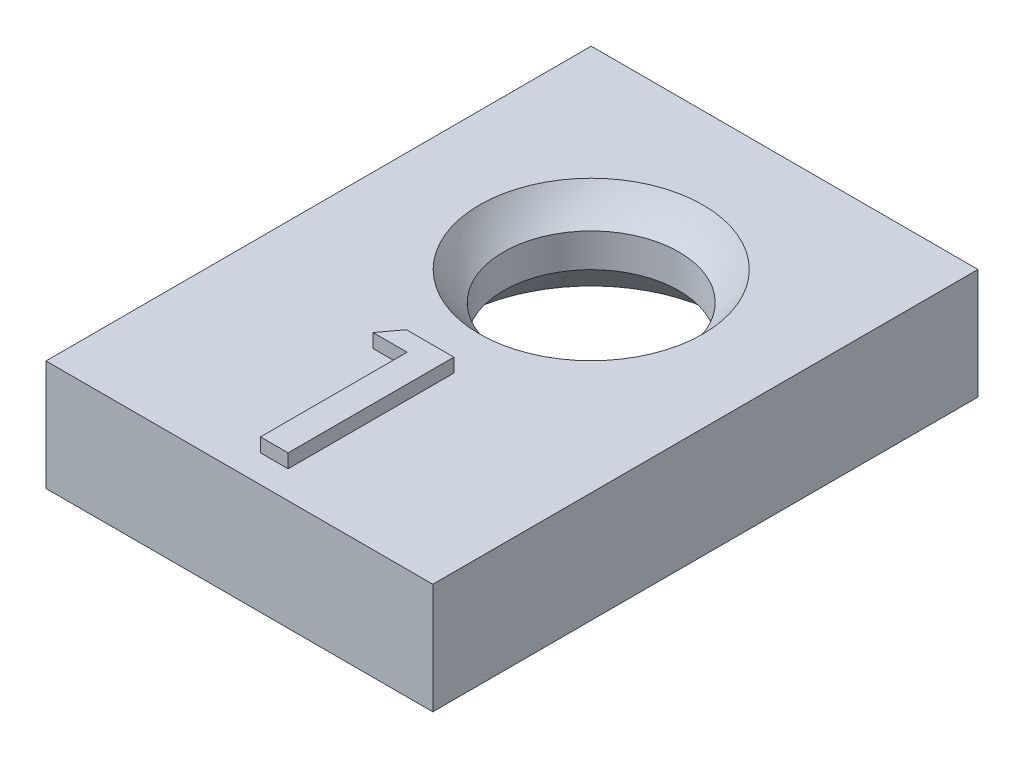
ISO-10303-21;
HEADER;
FILE_DESCRIPTION(('STEP AP214'),'2;1');
FILE_NAME('part.step','',(''),(''),'','','');
FILE_SCHEMA(('AUTOMOTIVE_DESIGN { 1 0 10303 214 1 1 1 1 }'));
ENDSEC;
DATA;
#1=APPLICATION_CONTEXT('core data for automotive mechanical design processes');
#2=APPLICATION_PROTOCOL_DEFINITION('international standard','automotive_design',2000,#1);
#3=PRODUCT_CONTEXT('',#1,'mechanical');
#4=PRODUCT('Part','Part','',(#3));
#5=PRODUCT_RELATED_PRODUCT_CATEGORY('part','',(#4));
#6=PRODUCT_DEFINITION_FORMATION('','',#4);
#7=PRODUCT_DEFINITION_CONTEXT('part definition',#1,'design');
#8=PRODUCT_DEFINITION('design','',#6,#7);
#9=PRODUCT_DEFINITION_SHAPE('','',#8);
#10=(LENGTH_UNIT() NAMED_UNIT(*) SI_UNIT(.MILLI.,.METRE.));
#11=(NAMED_UNIT(*) PLANE_ANGLE_UNIT() SI_UNIT($,.RADIAN.));
#12=(NAMED_UNIT(*) SI_UNIT($,.STERADIAN.) SOLID_ANGLE_UNIT());
#13=UNCERTAINTY_MEASURE_WITH_UNIT(LENGTH_MEASURE(1.E-05),#10,'distance_accuracy_value','');
#14=(GEOMETRIC_REPRESENTATION_CONTEXT(3) GLOBAL_UNCERTAINTY_ASSIGNED_CONTEXT((#13)) GLOBAL_UNIT_ASSIGNED_CONTEXT((#10,
#11,#12)) REPRESENTATION_CONTEXT('',''));
#15=CARTESIAN_POINT('',(0.,0.,0.));
#16=DIRECTION('',(0.,0.,1.));
#17=DIRECTION('',(1.,0.,0.));
#18=AXIS2_PLACEMENT_3D('',#15,#16,#17);
#19=CARTESIAN_POINT('',(0.,-15.5700000000001,1.90819582357449E-13));
#20=DIRECTION('',(0.,1.,0.));
#21=DIRECTION('',(-1.,0.,0.));
#22=AXIS2_PLACEMENT_3D('',#19,#20,#21);
#23=PLANE('',#22);
#24=CARTESIAN_POINT('',(-18.0191847198285,-15.5700000000003,-18.0208152801712));
#25=DIRECTION('',(0.,1.,0.));
#26=DIRECTION('',(0.,0.,1.));
#27=AXIS2_PLACEMENT_3D('',#24,#25,#26);
#28=CIRCLE('',#27,4.04583118777837);
#29=CARTESIAN_POINT('',(-18.0191847198285,-15.5700000000003,-22.0666464679495));
#30=VERTEX_POINT('',#29);
#31=EDGE_CURVE('E146',#30,#30,#28,.T.);
#32=ORIENTED_EDGE('',*,*,#31,.F.);
#33=EDGE_LOOP('',(#32));
#34=FACE_BOUND('',#33,.T.);
#35=DIRECTION('',(-1.,0.,0.));
#36=VECTOR('',#35,1.);
#37=CARTESIAN_POINT('',(-17.2563986058976,-15.5700000000002,-6.28677584414649));
#38=LINE('',#37,#36);
#39=CARTESIAN_POINT('',(-17.2563986058976,-15.5700000000002,-6.28677584414649));
#40=VERTEX_POINT('',#39);
#41=CARTESIAN_POINT('',(-18.2563986058976,-15.5700000000002,-6.28677584414649));
#42=VERTEX_POINT('',#41);
#43=EDGE_CURVE('E190',#40,#42,#38,.T.);
#44=ORIENTED_EDGE('',*,*,#43,.T.);
#45=DIRECTION('',(0.,0.,-1.));
#46=VECTOR('',#45,1.);
#47=CARTESIAN_POINT('',(-18.2563986058976,-15.5700000000002,-6.28677584414649));
#48=LINE('',#47,#46);
#49=CARTESIAN_POINT('',(-18.2563986058976,-15.5700000000002,-11.5944681518388));
#50=VERTEX_POINT('',#49);
#51=EDGE_CURVE('E193',#42,#50,#48,.T.);
#52=ORIENTED_EDGE('',*,*,#51,.T.);
#53=DIRECTION('',(-1.,0.,0.));
#54=VECTOR('',#53,1.);
#55=CARTESIAN_POINT('',(-18.2563986058976,-15.5700000000002,-11.5944681518388));
#56=LINE('',#55,#54);
#57=CARTESIAN_POINT('',(-19.4871678366668,-15.5700000000002,-11.5944681518388));
#58=VERTEX_POINT('',#57);
#59=EDGE_CURVE('E168',#50,#58,#56,.T.);
#60=ORIENTED_EDGE('',*,*,#59,.T.);
#61=DIRECTION('',(0.592817428421696,0.,-0.805336883893621));
#62=VECTOR('',#61,1.);
#63=CARTESIAN_POINT('',(-19.4871678366668,-15.5700000000002,-11.5944681518388));
#64=LINE('',#63,#62);
#65=CARTESIAN_POINT('',(-18.9775524520514,-15.5700000000002,-12.2867758441465));
#66=VERTEX_POINT('',#65);
#67=EDGE_CURVE('E76',#58,#66,#64,.T.);
#68=ORIENTED_EDGE('',*,*,#67,.T.);
#69=DIRECTION('',(1.,0.,0.));
#70=VECTOR('',#69,1.);
#71=CARTESIAN_POINT('',(-18.9775524520514,-15.5700000000002,-12.2867758441465));
#72=LINE('',#71,#70);
#73=CARTESIAN_POINT('',(-17.2563986058976,-15.5700000000002,-12.2867758441465));
#74=VERTEX_POINT('',#73);
#75=EDGE_CURVE('E185',#66,#74,#72,.T.);
#76=ORIENTED_EDGE('',*,*,#75,.T.);
#77=DIRECTION('',(0.,0.,1.));
#78=VECTOR('',#77,1.);
#79=CARTESIAN_POINT('',(-17.2563986058976,-15.5700000000002,-12.2867758441465));
#80=LINE('',#79,#78);
#81=EDGE_CURVE('E188',#74,#40,#80,.T.);
#82=ORIENTED_EDGE('',*,*,#81,.T.);
#83=EDGE_LOOP('',(#44,#52,#60,#68,#76,#82));
#84=FACE_BOUND('',#83,.T.);
#85=DIRECTION('',(1.,0.,0.));
#86=VECTOR('',#85,1.);
#87=CARTESIAN_POINT('',(0.,-15.5700000000001,-5.28677584414649));
#88=LINE('',#87,#86);
#89=CARTESIAN_POINT('',(-25.0191847198285,-15.5700000000002,-5.28677584414648));
#90=VERTEX_POINT('',#89);
#91=CARTESIAN_POINT('',(-11.0191847198285,-15.5700000000002,-5.28677584414649));
#92=VERTEX_POINT('',#91);
#93=EDGE_CURVE('E68',#90,#92,#88,.T.);
#94=ORIENTED_EDGE('',*,*,#93,.T.);
#95=DIRECTION('',(0.,0.,-1.));
#96=VECTOR('',#95,1.);
#97=CARTESIAN_POINT('',(-11.0191847198285,-15.5700000000002,1.91788225319858E-13));
#98=LINE('',#97,#96);
#99=CARTESIAN_POINT('',(-11.0191847198285,-15.5700000000002,-25.0208152801712));
#100=VERTEX_POINT('',#99);
#101=EDGE_CURVE('E159',#92,#100,#98,.T.);
#102=ORIENTED_EDGE('',*,*,#101,.T.);
#103=DIRECTION('',(-1.,0.,0.));
#104=VECTOR('',#103,1.);
#105=CARTESIAN_POINT('',(-5.99999999999993,-15.5700000000002,-25.0208152801712));
#106=LINE('',#105,#104);
#107=CARTESIAN_POINT('',(-25.0191847198285,-15.5700000000003,-25.0208152801712));
#108=VERTEX_POINT('',#107);
#109=EDGE_CURVE('E161',#100,#108,#106,.T.);
#110=ORIENTED_EDGE('',*,*,#109,.T.);
#111=DIRECTION('',(0.,0.,1.));
#112=VECTOR('',#111,1.);
#113=CARTESIAN_POINT('',(-25.0191847198285,-15.5700000000002,0.));
#114=LINE('',#113,#112);
#115=EDGE_CURVE('E155',#108,#90,#114,.T.);
#116=ORIENTED_EDGE('',*,*,#115,.T.);
#117=EDGE_LOOP('',(#94,#102,#110,#116));
#118=FACE_BOUND('',#117,.T.);
#119=ADVANCED_FACE('F52',(#34,#84,#118),#23,.T.);
#120=CARTESIAN_POINT('',(0.,-19.5700000000001,2.04697370165263E-13));
#121=DIRECTION('',(0.,1.,0.));
#122=DIRECTION('',(-1.,0.,0.));
#123=AXIS2_PLACEMENT_3D('',#120,#121,#122);
#124=PLANE('',#123);
#125=CARTESIAN_POINT('',(-18.0191847198285,-19.5700000000003,-18.0208152801712));
#126=DIRECTION('',(0.,1.,0.));
#127=DIRECTION('',(0.,0.,1.));
#128=AXIS2_PLACEMENT_3D('',#125,#126,#127);
#129=CIRCLE('',#128,4.92499999999974);
#130=CARTESIAN_POINT('',(-18.0191847198285,-19.5700000000002,-13.0958152801714));
#131=VERTEX_POINT('',#130);
#132=EDGE_CURVE('E61',#131,#131,#129,.T.);
#133=ORIENTED_EDGE('',*,*,#132,.T.);
#134=EDGE_LOOP('',(#133));
#135=FACE_BOUND('',#134,.T.);
#136=DIRECTION('',(0.,0.,-1.));
#137=VECTOR('',#136,1.);
#138=CARTESIAN_POINT('',(-11.0191847198285,-19.5700000000006,-25.0208152801712));
#139=LINE('',#138,#137);
#140=CARTESIAN_POINT('',(-11.0191847198285,-19.5700000000005,-5.28677584414648));
#141=VERTEX_POINT('',#140);
#142=CARTESIAN_POINT('',(-11.0191847198285,-19.5700000000006,-25.0208152801712));
#143=VERTEX_POINT('',#142);
#144=EDGE_CURVE('E139',#141,#143,#139,.T.);
#145=ORIENTED_EDGE('',*,*,#144,.F.);
#146=DIRECTION('',(1.,0.,0.));
#147=VECTOR('',#146,1.);
#148=CARTESIAN_POINT('',(-25.0191847198285,-19.5700000000006,-5.28677584414648));
#149=LINE('',#148,#147);
#150=CARTESIAN_POINT('',(-25.0191847198285,-19.5700000000006,-5.28677584414648));
#151=VERTEX_POINT('',#150);
#152=EDGE_CURVE('E132',#151,#141,#149,.T.);
#153=ORIENTED_EDGE('',*,*,#152,.F.);
#154=DIRECTION('',(0.,0.,-1.));
#155=VECTOR('',#154,1.);
#156=CARTESIAN_POINT('',(-25.0191847198285,-19.5700000000002,0.));
#157=LINE('',#156,#155);
#158=CARTESIAN_POINT('',(-25.0191847198285,-19.5700000000003,-25.0208152801712));
#159=VERTEX_POINT('',#158);
#160=EDGE_CURVE('E144',#151,#159,#157,.T.);
#161=ORIENTED_EDGE('',*,*,#160,.T.);
#162=DIRECTION('',(1.,0.,0.));
#163=VECTOR('',#162,1.);
#164=CARTESIAN_POINT('',(-5.99999999999992,-19.5700000000002,-25.0208152801712));
#165=LINE('',#164,#163);
#166=EDGE_CURVE('E152',#159,#143,#165,.T.);
#167=ORIENTED_EDGE('',*,*,#166,.T.);
#168=EDGE_LOOP('',(#145,#153,#161,#167));
#169=FACE_BOUND('',#168,.T.);
#170=ADVANCED_FACE('F142',(#135,#169),#124,.F.);
#171=CARTESIAN_POINT('',(-5.99999999999981,-50.9988177425023,-25.0208152801711));
#172=DIRECTION('',(0.,0.,-1.));
#173=DIRECTION('',(0.,1.,0.));
#174=AXIS2_PLACEMENT_3D('',#171,#172,#173);
#175=PLANE('',#174);
#176=ORIENTED_EDGE('',*,*,#109,.F.);
#177=DIRECTION('',(0.,1.,0.));
#178=VECTOR('',#177,1.);
#179=CARTESIAN_POINT('',(-11.0191847198285,-19.5700000000006,-25.0208152801712));
#180=LINE('',#179,#178);
#181=EDGE_CURVE('E281',#143,#100,#180,.T.);
#182=ORIENTED_EDGE('',*,*,#181,.F.);
#183=ORIENTED_EDGE('',*,*,#166,.F.);
#184=DIRECTION('',(0.,1.,0.));
#185=VECTOR('',#184,1.);
#186=CARTESIAN_POINT('',(-25.0191847198284,-50.9988177425024,-25.0208152801711));
#187=LINE('',#186,#185);
#188=EDGE_CURVE('E151',#159,#108,#187,.T.);
#189=ORIENTED_EDGE('',*,*,#188,.T.);
#190=EDGE_LOOP('',(#176,#182,#183,#189));
#191=FACE_BOUND('',#190,.T.);
#192=ADVANCED_FACE('F233',(#191),#175,.T.);
#193=CARTESIAN_POINT('',(-25.0191847198284,-50.9988177425023,1.80390598819962E-13));
#194=DIRECTION('',(-1.,0.,0.));
#195=DIRECTION('',(0.,-1.,0.));
#196=AXIS2_PLACEMENT_3D('',#193,#194,#195);
#197=PLANE('',#196);
#198=ORIENTED_EDGE('',*,*,#160,.F.);
#199=DIRECTION('',(0.,1.,0.));
#200=VECTOR('',#199,1.);
#201=CARTESIAN_POINT('',(-25.0191847198285,-19.5700000000006,-5.28677584414648));
#202=LINE('',#201,#200);
#203=EDGE_CURVE('E129',#151,#90,#202,.T.);
#204=ORIENTED_EDGE('',*,*,#203,.T.);
#205=ORIENTED_EDGE('',*,*,#115,.F.);
#206=ORIENTED_EDGE('',*,*,#188,.F.);
#207=EDGE_LOOP('',(#198,#204,#205,#206));
#208=FACE_BOUND('',#207,.T.);
#209=ADVANCED_FACE('F149',(#208),#197,.T.);
#210=CARTESIAN_POINT('',(-19.4871678366668,-15.0700000000002,-11.5944681518388));
#211=DIRECTION('',(-0.805336883893621,0.,-0.592817428421696));
#212=DIRECTION('',(-0.592817428421696,0.,0.805336883893621));
#213=AXIS2_PLACEMENT_3D('',#210,#211,#212);
#214=PLANE('',#213);
#215=ORIENTED_EDGE('',*,*,#67,.F.);
#216=DIRECTION('',(0.,-1.,0.));
#217=VECTOR('',#216,1.);
#218=CARTESIAN_POINT('',(-19.4871678366668,-15.0700000000002,-11.5944681518388));
#219=LINE('',#218,#217);
#220=CARTESIAN_POINT('',(-19.4871678366668,-15.0700000000002,-11.5944681518388));
#221=VERTEX_POINT('',#220);
#222=EDGE_CURVE('E196',#221,#58,#219,.T.);
#223=ORIENTED_EDGE('',*,*,#222,.F.);
#224=DIRECTION('',(0.592817428421696,0.,-0.805336883893621));
#225=VECTOR('',#224,1.);
#226=CARTESIAN_POINT('',(-19.4871678366668,-15.0700000000002,-11.5944681518388));
#227=LINE('',#226,#225);
#228=CARTESIAN_POINT('',(-18.9775524520514,-15.0700000000002,-12.2867758441465));
#229=VERTEX_POINT('',#228);
#230=EDGE_CURVE('E164',#221,#229,#227,.T.);
#231=ORIENTED_EDGE('',*,*,#230,.T.);
#232=DIRECTION('',(0.,-1.,0.));
#233=VECTOR('',#232,1.);
#234=CARTESIAN_POINT('',(-18.9775524520514,-15.0700000000002,-12.2867758441465));
#235=LINE('',#234,#233);
#236=EDGE_CURVE('E183',#229,#66,#235,.T.);
#237=ORIENTED_EDGE('',*,*,#236,.T.);
#238=EDGE_LOOP('',(#215,#223,#231,#237));
#239=FACE_BOUND('',#238,.T.);
#240=ADVANCED_FACE('F237',(#239),#214,.T.);
#241=CARTESIAN_POINT('',(-18.2563986058976,-15.0700000000002,-11.5944681518388));
#242=DIRECTION('',(0.,0.,1.));
#243=DIRECTION('',(0.,-1.,0.));
#244=AXIS2_PLACEMENT_3D('',#241,#242,#243);
#245=PLANE('',#244);
#246=ORIENTED_EDGE('',*,*,#59,.F.);
#247=DIRECTION('',(0.,-1.,0.));
#248=VECTOR('',#247,1.);
#249=CARTESIAN_POINT('',(-18.2563986058976,-15.0700000000002,-11.5944681518388));
#250=LINE('',#249,#248);
#251=CARTESIAN_POINT('',(-18.2563986058976,-15.0700000000002,-11.5944681518388));
#252=VERTEX_POINT('',#251);
#253=EDGE_CURVE('E200',#252,#50,#250,.T.);
#254=ORIENTED_EDGE('',*,*,#253,.F.);
#255=DIRECTION('',(-1.,0.,0.));
#256=VECTOR('',#255,1.);
#257=CARTESIAN_POINT('',(-18.2563986058976,-15.0700000000002,-11.5944681518388));
#258=LINE('',#257,#256);
#259=EDGE_CURVE('E180',#252,#221,#258,.T.);
#260=ORIENTED_EDGE('',*,*,#259,.T.);
#261=ORIENTED_EDGE('',*,*,#222,.T.);
#262=EDGE_LOOP('',(#246,#254,#260,#261));
#263=FACE_BOUND('',#262,.T.);
#264=ADVANCED_FACE('F240',(#263),#245,.T.);
#265=CARTESIAN_POINT('',(-18.2563986058976,-15.0700000000002,-6.28677584414649));
#266=DIRECTION('',(-1.,0.,0.));
#267=DIRECTION('',(0.,-1.,0.));
#268=AXIS2_PLACEMENT_3D('',#265,#266,#267);
#269=PLANE('',#268);
#270=ORIENTED_EDGE('',*,*,#51,.F.);
#271=DIRECTION('',(0.,-1.,0.));
#272=VECTOR('',#271,1.);
#273=CARTESIAN_POINT('',(-18.2563986058976,-15.0700000000002,-6.28677584414649));
#274=LINE('',#273,#272);
#275=CARTESIAN_POINT('',(-18.2563986058976,-15.0700000000002,-6.28677584414649));
#276=VERTEX_POINT('',#275);
#277=EDGE_CURVE('E202',#276,#42,#274,.T.);
#278=ORIENTED_EDGE('',*,*,#277,.F.);
#279=DIRECTION('',(0.,0.,-1.));
#280=VECTOR('',#279,1.);
#281=CARTESIAN_POINT('',(-18.2563986058976,-15.0700000000002,-6.28677584414649));
#282=LINE('',#281,#280);
#283=EDGE_CURVE('E177',#276,#252,#282,.T.);
#284=ORIENTED_EDGE('',*,*,#283,.T.);
#285=ORIENTED_EDGE('',*,*,#253,.T.);
#286=EDGE_LOOP('',(#270,#278,#284,#285));
#287=FACE_BOUND('',#286,.T.);
#288=ADVANCED_FACE('F253',(#287),#269,.T.);
#289=CARTESIAN_POINT('',(-17.2563986058976,-15.0700000000002,-6.28677584414649));
#290=DIRECTION('',(0.,0.,1.));
#291=DIRECTION('',(0.,-1.,0.));
#292=AXIS2_PLACEMENT_3D('',#289,#290,#291);
#293=PLANE('',#292);
#294=ORIENTED_EDGE('',*,*,#43,.F.);
#295=DIRECTION('',(0.,-1.,0.));
#296=VECTOR('',#295,1.);
#297=CARTESIAN_POINT('',(-17.2563986058976,-15.0700000000002,-6.28677584414649));
#298=LINE('',#297,#296);
#299=CARTESIAN_POINT('',(-17.2563986058976,-15.0700000000002,-6.28677584414649));
#300=VERTEX_POINT('',#299);
#301=EDGE_CURVE('E205',#300,#40,#298,.T.);
#302=ORIENTED_EDGE('',*,*,#301,.F.);
#303=DIRECTION('',(-1.,0.,0.));
#304=VECTOR('',#303,1.);
#305=CARTESIAN_POINT('',(-17.2563986058976,-15.0700000000002,-6.28677584414649));
#306=LINE('',#305,#304);
#307=EDGE_CURVE('E174',#300,#276,#306,.T.);
#308=ORIENTED_EDGE('',*,*,#307,.T.);
#309=ORIENTED_EDGE('',*,*,#277,.T.);
#310=EDGE_LOOP('',(#294,#302,#308,#309));
#311=FACE_BOUND('',#310,.T.);
#312=ADVANCED_FACE('F249',(#311),#293,.T.);
#313=CARTESIAN_POINT('',(-17.2563986058976,-15.0700000000002,-12.2867758441465));
#314=DIRECTION('',(1.,0.,0.));
#315=DIRECTION('',(0.,1.,0.));
#316=AXIS2_PLACEMENT_3D('',#313,#314,#315);
#317=PLANE('',#316);
#318=ORIENTED_EDGE('',*,*,#81,.F.);
#319=DIRECTION('',(0.,-1.,0.));
#320=VECTOR('',#319,1.);
#321=CARTESIAN_POINT('',(-17.2563986058976,-15.0700000000002,-12.2867758441465));
#322=LINE('',#321,#320);
#323=CARTESIAN_POINT('',(-17.2563986058976,-15.0700000000002,-12.2867758441465));
#324=VERTEX_POINT('',#323);
#325=EDGE_CURVE('E208',#324,#74,#322,.T.);
#326=ORIENTED_EDGE('',*,*,#325,.F.);
#327=DIRECTION('',(0.,0.,1.));
#328=VECTOR('',#327,1.);
#329=CARTESIAN_POINT('',(-17.2563986058976,-15.0700000000002,-12.2867758441465));
#330=LINE('',#329,#328);
#331=EDGE_CURVE('E171',#324,#300,#330,.T.);
#332=ORIENTED_EDGE('',*,*,#331,.T.);
#333=ORIENTED_EDGE('',*,*,#301,.T.);
#334=EDGE_LOOP('',(#318,#326,#332,#333));
#335=FACE_BOUND('',#334,.T.);
#336=ADVANCED_FACE('F245',(#335),#317,.T.);
#337=CARTESIAN_POINT('',(-18.9775524520514,-15.0700000000002,-12.2867758441465));
#338=DIRECTION('',(0.,0.,-1.));
#339=DIRECTION('',(0.,1.,0.));
#340=AXIS2_PLACEMENT_3D('',#337,#338,#339);
#341=PLANE('',#340);
#342=ORIENTED_EDGE('',*,*,#75,.F.);
#343=ORIENTED_EDGE('',*,*,#236,.F.);
#344=DIRECTION('',(1.,0.,0.));
#345=VECTOR('',#344,1.);
#346=CARTESIAN_POINT('',(-18.9775524520514,-15.0700000000002,-12.2867758441465));
#347=LINE('',#346,#345);
#348=EDGE_CURVE('E167',#229,#324,#347,.T.);
#349=ORIENTED_EDGE('',*,*,#348,.T.);
#350=ORIENTED_EDGE('',*,*,#325,.T.);
#351=EDGE_LOOP('',(#342,#343,#349,#350));
#352=FACE_BOUND('',#351,.T.);
#353=ADVANCED_FACE('F241',(#352),#341,.T.);
#354=CARTESIAN_POINT('',(0.,-15.0700000000002,0.));
#355=DIRECTION('',(0.,-1.,0.));
#356=DIRECTION('',(1.,0.,0.));
#357=AXIS2_PLACEMENT_3D('',#354,#355,#356);
#358=PLANE('',#357);
#359=ORIENTED_EDGE('',*,*,#230,.F.);
#360=ORIENTED_EDGE('',*,*,#259,.F.);
#361=ORIENTED_EDGE('',*,*,#283,.F.);
#362=ORIENTED_EDGE('',*,*,#307,.F.);
#363=ORIENTED_EDGE('',*,*,#331,.F.);
#364=ORIENTED_EDGE('',*,*,#348,.F.);
#365=EDGE_LOOP('',(#359,#360,#361,#362,#363,#364));
#366=FACE_BOUND('',#365,.T.);
#367=ADVANCED_FACE('F244',(#366),#358,.F.);
#368=CARTESIAN_POINT('',(-18.0191847198285,-19.5700000000005,-18.0208152801712));
#369=DIRECTION('',(0.,1.,0.));
#370=DIRECTION('',(0.,0.,1.));
#371=AXIS2_PLACEMENT_3D('',#368,#369,#370);
#372=CYLINDRICAL_SURFACE('',#371,3.175);
#373=CARTESIAN_POINT('',(-18.0191847198285,-17.8200000000005,-18.0208152801712));
#374=DIRECTION('',(0.,1.,0.));
#375=DIRECTION('',(0.,0.,1.));
#376=AXIS2_PLACEMENT_3D('',#373,#374,#375);
#377=CIRCLE('',#376,3.175);
#378=CARTESIAN_POINT('',(-18.0191847198285,-17.8200000000005,-14.8458152801712));
#379=VERTEX_POINT('',#378);
#380=EDGE_CURVE('E12',#379,#379,#377,.F.);
#381=ORIENTED_EDGE('',*,*,#380,.T.);
#382=EDGE_LOOP('',(#381));
#383=FACE_BOUND('',#382,.T.);
#384=CARTESIAN_POINT('',(-18.0191847198285,-16.6072579142812,-18.0208152801712));
#385=DIRECTION('',(0.,1.,0.));
#386=DIRECTION('',(0.,0.,1.));
#387=AXIS2_PLACEMENT_3D('',#384,#385,#386);
#388=CIRCLE('',#387,3.175);
#389=CARTESIAN_POINT('',(-18.0191847198285,-16.6072579142812,-21.1958152801712));
#390=VERTEX_POINT('',#389);
#391=EDGE_CURVE('E211',#390,#390,#388,.T.);
#392=ORIENTED_EDGE('',*,*,#391,.T.);
#393=EDGE_LOOP('',(#392));
#394=FACE_BOUND('',#393,.T.);
#395=ADVANCED_FACE('F263',(#383,#394),#372,.F.);
#396=CARTESIAN_POINT('',(-11.0191847198285,-19.5700000000006,-25.0208152801712));
#397=DIRECTION('',(1.,0.,0.));
#398=DIRECTION('',(0.,1.,0.));
#399=AXIS2_PLACEMENT_3D('',#396,#397,#398);
#400=PLANE('',#399);
#401=DIRECTION('',(0.,1.,0.));
#402=VECTOR('',#401,1.);
#403=CARTESIAN_POINT('',(-11.0191847198285,-19.5700000000005,-5.28677584414648));
#404=LINE('',#403,#402);
#405=EDGE_CURVE('E138',#141,#92,#404,.T.);
#406=ORIENTED_EDGE('',*,*,#405,.F.);
#407=ORIENTED_EDGE('',*,*,#144,.T.);
#408=ORIENTED_EDGE('',*,*,#181,.T.);
#409=ORIENTED_EDGE('',*,*,#101,.F.);
#410=EDGE_LOOP('',(#406,#407,#408,#409));
#411=FACE_BOUND('',#410,.T.);
#412=ADVANCED_FACE('F271',(#411),#400,.T.);
#413=CARTESIAN_POINT('',(-25.0191847198285,-19.5700000000006,-5.28677584414648));
#414=DIRECTION('',(0.,0.,1.));
#415=DIRECTION('',(0.,-1.,0.));
#416=AXIS2_PLACEMENT_3D('',#413,#414,#415);
#417=PLANE('',#416);
#418=ORIENTED_EDGE('',*,*,#203,.F.);
#419=ORIENTED_EDGE('',*,*,#152,.T.);
#420=ORIENTED_EDGE('',*,*,#405,.T.);
#421=ORIENTED_EDGE('',*,*,#93,.F.);
#422=EDGE_LOOP('',(#418,#419,#420,#421));
#423=FACE_BOUND('',#422,.T.);
#424=ADVANCED_FACE('F131',(#423),#417,.T.);
#425=CARTESIAN_POINT('',(-18.0191847198285,-13.0575000000003,-18.0208152801712));
#426=DIRECTION('',(0.,1.,0.));
#427=DIRECTION('',(0.,0.,-1.));
#428=AXIS2_PLACEMENT_3D('',#425,#426,#427);
#429=SPHERICAL_SURFACE('',#428,4.7625);
#430=CARTESIAN_POINT('',(-18.0191847198285,-15.5700000000003,-22.0666464679495));
#431=CARTESIAN_POINT('',(-18.0191847198285,-15.5820255600881,-22.0591784818335));
#432=CARTESIAN_POINT('',(-18.0191847198285,-15.5940178222616,-22.0516568767688));
#433=CARTESIAN_POINT('',(-18.0191847198285,-15.6179348014821,-22.03650703349));
#434=CARTESIAN_POINT('',(-18.0191847198285,-15.6298595185292,-22.0288787952758));
#435=CARTESIAN_POINT('',(-18.0191847198285,-15.6536404581997,-22.0135162904453));
#436=CARTESIAN_POINT('',(-18.0191847198285,-15.6654966808231,-22.005782023829));
#437=CARTESIAN_POINT('',(-18.0191847198285,-15.6891396892339,-21.9902080776443));
#438=CARTESIAN_POINT('',(-18.0191847198285,-15.7009264750214,-21.9823683980759));
#439=CARTESIAN_POINT('',(-18.0191847198285,-15.7244296724837,-21.9665842492097));
#440=CARTESIAN_POINT('',(-18.0191847198285,-15.7361460841585,-21.958639779912));
#441=CARTESIAN_POINT('',(-18.0191847198285,-15.7595076018178,-21.9426466833052));
#442=CARTESIAN_POINT('',(-18.0191847198285,-15.7711527078023,-21.9345980559961));
#443=CARTESIAN_POINT('',(-18.0191847198285,-15.794370688145,-21.9183972833229));
#444=CARTESIAN_POINT('',(-18.0191847198285,-15.8059435625033,-21.9102451379587));
#445=CARTESIAN_POINT('',(-18.0191847198285,-15.8290161594087,-21.893837977374));
#446=CARTESIAN_POINT('',(-18.0191847198285,-15.8405158819557,-21.8855829621535));
#447=CARTESIAN_POINT('',(-18.0191847198285,-15.8634412608681,-21.8689707182312));
#448=CARTESIAN_POINT('',(-18.0191847198285,-15.8748669172335,-21.8606134895295));
#449=CARTESIAN_POINT('',(-18.0191847198285,-15.8976432553015,-21.8437974831481));
#450=CARTESIAN_POINT('',(-18.0191847198285,-15.9089939370042,-21.8353387054684));
#451=CARTESIAN_POINT('',(-18.0191847198285,-15.9316194232274,-21.8183202737084));
#452=CARTESIAN_POINT('',(-18.0191847198285,-15.942894227748,-21.809760619628));
#453=CARTESIAN_POINT('',(-18.0191847198285,-15.9653670631205,-21.7925411156651));
#454=CARTESIAN_POINT('',(-18.0191847198285,-15.9765650939724,-21.7838812657825));
#455=CARTESIAN_POINT('',(-18.0191847198285,-15.9988834916259,-21.7664620587802));
#456=CARTESIAN_POINT('',(-18.0191847198285,-16.0100038584274,-21.7577027016604));
#457=CARTESIAN_POINT('',(-18.0191847198285,-16.0321660437733,-21.740085176661));
#458=CARTESIAN_POINT('',(-18.0191847198285,-16.0432078623176,-21.7312270087813));
#459=CARTESIAN_POINT('',(-18.0191847198285,-16.0652120731881,-21.713412566596));
#460=CARTESIAN_POINT('',(-18.0191847198285,-16.0761744655142,-21.7044562922902));
#461=CARTESIAN_POINT('',(-18.0191847198285,-16.0980189523025,-21.6864463493873));
#462=CARTESIAN_POINT('',(-18.0191847198285,-16.1089010467646,-21.6773926807901));
#463=CARTESIAN_POINT('',(-18.0191847198285,-16.1305840725638,-21.6591886691828));
#464=CARTESIAN_POINT('',(-18.0191847198285,-16.1413850039009,-21.6500383261727));
#465=CARTESIAN_POINT('',(-18.0191847198285,-16.1629048446424,-21.631641693305));
#466=CARTESIAN_POINT('',(-18.0191847198285,-16.1736237540469,-21.6223954034474));
#467=CARTESIAN_POINT('',(-18.0191847198285,-16.1949786986372,-21.6038076120791));
#468=CARTESIAN_POINT('',(-18.0191847198285,-16.2056147338232,-21.5944661105684));
#469=CARTESIAN_POINT('',(-18.0191847198285,-16.2268030842803,-21.5756886386588));
#470=CARTESIAN_POINT('',(-18.0191847198285,-16.2373553995514,-21.5662526682598));
#471=CARTESIAN_POINT('',(-18.0191847198285,-16.2583754711394,-21.5472870088501));
#472=CARTESIAN_POINT('',(-18.0191847198285,-16.2688432274562,-21.5377573198393));
#473=CARTESIAN_POINT('',(-18.0191847198285,-16.2896933488194,-21.5186049809338));
#474=CARTESIAN_POINT('',(-18.0191847198285,-16.3000757138658,-21.5089823310392));
#475=CARTESIAN_POINT('',(-18.0191847198285,-16.3207542271617,-21.4896448354858));
#476=CARTESIAN_POINT('',(-18.0191847198285,-16.3310503754113,-21.4799299898271));
#477=CARTESIAN_POINT('',(-18.0191847198285,-16.3515556364426,-21.4604088751958));
#478=CARTESIAN_POINT('',(-18.0191847198285,-16.3617647492243,-21.4506026062232));
#479=CARTESIAN_POINT('',(-18.0191847198285,-16.382095127569,-21.4308994246839));
#480=CARTESIAN_POINT('',(-18.0191847198285,-16.392216393132,-21.4210025121172));
#481=CARTESIAN_POINT('',(-18.0191847198285,-16.412370272274,-21.4011188303168));
#482=CARTESIAN_POINT('',(-18.0191847198285,-16.4224028858531,-21.3911320610832));
#483=CARTESIAN_POINT('',(-18.0191847198285,-16.4423786633083,-21.3710694600189));
#484=CARTESIAN_POINT('',(-18.0191847198285,-16.4523218271845,-21.3609936281882));
#485=CARTESIAN_POINT('',(-18.0191847198285,-16.4721179146375,-21.3407537030902));
#486=CARTESIAN_POINT('',(-18.0191847198285,-16.4819708382143,-21.3305896098229));
#487=CARTESIAN_POINT('',(-18.0191847198285,-16.5015856616093,-21.3101739699955));
#488=CARTESIAN_POINT('',(-18.0191847198285,-16.5113475614274,-21.2999224234352));
#489=CARTESIAN_POINT('',(-18.0191847198285,-16.5307795612257,-21.2793326922491));
#490=CARTESIAN_POINT('',(-18.0191847198285,-16.540449661206,-21.2689945076232));
#491=CARTESIAN_POINT('',(-18.0191847198285,-16.5596972920158,-21.2482323219366));
#492=CARTESIAN_POINT('',(-18.0191847198285,-16.5692748228455,-21.2378083208759));
#493=CARTESIAN_POINT('',(-18.0191847198285,-16.5883365553902,-21.2168753325847));
#494=CARTESIAN_POINT('',(-18.0191847198285,-16.5978207571053,-21.2063663453541));
#495=CARTESIAN_POINT('',(-18.0191847198285,-16.6072579142812,-21.1958152801712));
#496=B_SPLINE_CURVE_WITH_KNOTS('',3,(#430,#431,#432,#433,#434,#435,#436,#437,#438,#439,#440,
#441,#442,#443,#444,#445,#446,#447,#448,#449,#450,#451,#452,#453,#454,#455,#456,#457,#458,#459,
#460,#461,#462,#463,#464,#465,#466,#467,#468,#469,#470,#471,#472,#473,#474,#475,#476,#477,#478,
#479,#480,#481,#482,#483,#484,#485,#486,#487,#488,#489,#490,#491,#492,#493,#494,#495),
.UNSPECIFIED.,.F.,.F.,(4,2,2,2,2,2,2,2,2,2,2,2,2,2,2,2,2,2,2,2,2,2,2,2,2,2,2,2,2,2,2,2,4),(0.,
0.0424670725938464,0.0849341451876909,0.127401217781534,0.169868290375381,0.212335362969224,
0.254802435563069,0.297269508156912,0.339736580750758,0.382203653344603,0.424670725938447,
0.467137798532292,0.509604871126135,0.552071943719982,0.594539016313824,0.63700608890767,
0.679473161501514,0.721940234095359,0.764407306689205,0.806874379283048,0.849341451876895,
0.89180852447074,0.934275597064582,0.976742669658429,1.01920974225227,1.06167681484612,
1.10414388743996,1.14661096003381,1.18907803262765,1.2315451052215,1.27401217781534,
1.31647925040919,1.35894632300303),.UNSPECIFIED.);
#497=EDGE_CURVE('BSEAM218',#30,#390,#496,.T.);
#498=ORIENTED_EDGE('',*,*,#31,.T.);
#499=ORIENTED_EDGE('',*,*,#391,.F.);
#500=ORIENTED_EDGE('',*,*,#497,.T.);
#501=ORIENTED_EDGE('',*,*,#497,.F.);
#502=EDGE_LOOP('',(#498,#500,#499,#501));
#503=FACE_BOUND('',#502,.T.);
#504=ADVANCED_FACE('F218',(#503),#429,.F.);
#505=CARTESIAN_POINT('',(-18.0191847198285,-19.5700000000003,-18.0208152801712));
#506=DIRECTION('',(0.,-1.,0.));
#507=DIRECTION('',(0.,0.,-1.));
#508=AXIS2_PLACEMENT_3D('',#505,#506,#507);
#509=CONICAL_SURFACE('',#508,4.92499999999974,0.785398163397445);
#510=ORIENTED_EDGE('',*,*,#380,.F.);
#511=EDGE_LOOP('',(#510));
#512=FACE_BOUND('',#511,.T.);
#513=ORIENTED_EDGE('',*,*,#132,.F.);
#514=EDGE_LOOP('',(#513));
#515=FACE_BOUND('',#514,.T.);
#516=ADVANCED_FACE('F55',(#512,#515),#509,.F.);
#517=CLOSED_SHELL('',(#119,#170,#192,#209,#240,#264,#288,#312,#336,#353,#367,#395,#412,#424,
#504,#516));
#518=MANIFOLD_SOLID_BREP('B2',#517);
#519=ADVANCED_BREP_SHAPE_REPRESENTATION('',(#18,#518),#14);
#520=SHAPE_DEFINITION_REPRESENTATION(#9,#519);
ENDSEC;
END-ISO-10303-21;
